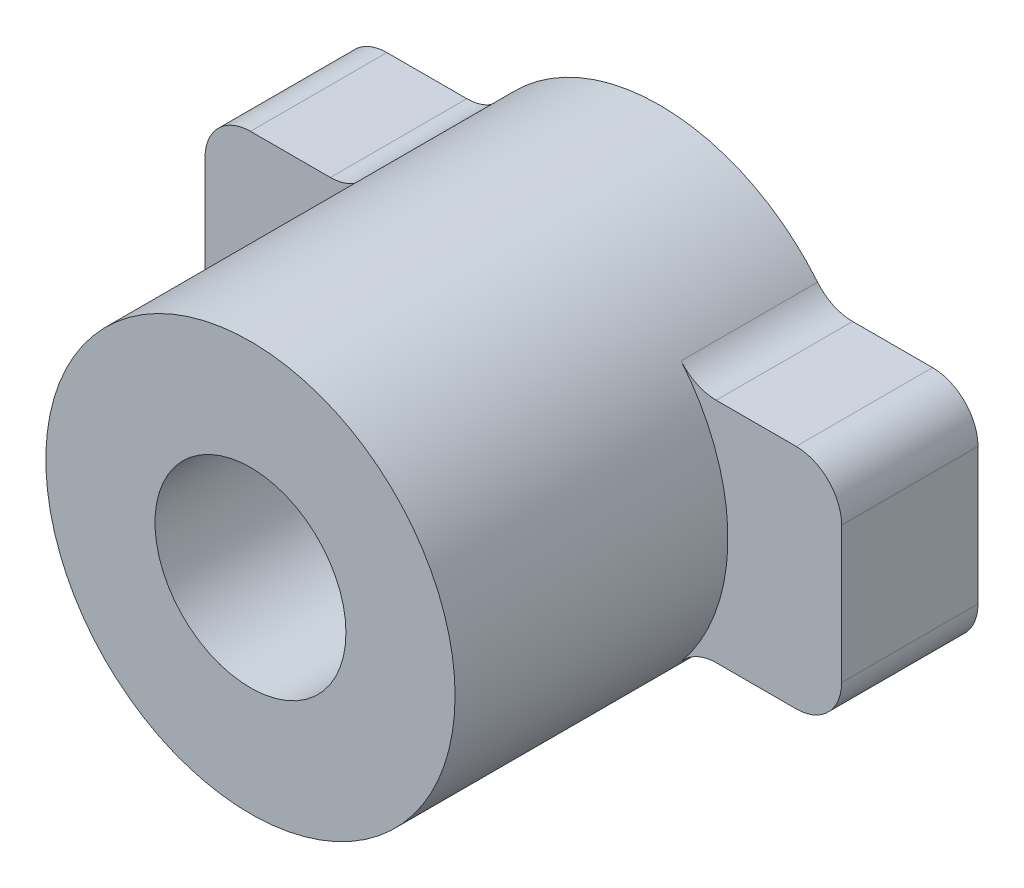
ISO-10303-21;
HEADER;
FILE_DESCRIPTION(('STEP AP214'),'2;1');
FILE_NAME('part.step','',(''),(''),'','','');
FILE_SCHEMA(('AUTOMOTIVE_DESIGN { 1 0 10303 214 1 1 1 1 }'));
ENDSEC;
DATA;
#1=APPLICATION_CONTEXT('core data for automotive mechanical design processes');
#2=APPLICATION_PROTOCOL_DEFINITION('international standard','automotive_design',2000,#1);
#3=PRODUCT_CONTEXT('',#1,'mechanical');
#4=PRODUCT('Part','Part','',(#3));
#5=PRODUCT_RELATED_PRODUCT_CATEGORY('part','',(#4));
#6=PRODUCT_DEFINITION_FORMATION('','',#4);
#7=PRODUCT_DEFINITION_CONTEXT('part definition',#1,'design');
#8=PRODUCT_DEFINITION('design','',#6,#7);
#9=PRODUCT_DEFINITION_SHAPE('','',#8);
#10=(LENGTH_UNIT() NAMED_UNIT(*) SI_UNIT(.MILLI.,.METRE.));
#11=(NAMED_UNIT(*) PLANE_ANGLE_UNIT() SI_UNIT($,.RADIAN.));
#12=(NAMED_UNIT(*) SI_UNIT($,.STERADIAN.) SOLID_ANGLE_UNIT());
#13=UNCERTAINTY_MEASURE_WITH_UNIT(LENGTH_MEASURE(1.E-05),#10,'distance_accuracy_value','');
#14=(GEOMETRIC_REPRESENTATION_CONTEXT(3) GLOBAL_UNCERTAINTY_ASSIGNED_CONTEXT((#13)) GLOBAL_UNIT_ASSIGNED_CONTEXT((#10,
#11,#12)) REPRESENTATION_CONTEXT('',''));
#15=CARTESIAN_POINT('',(0.,0.,0.));
#16=DIRECTION('',(0.,0.,1.));
#17=DIRECTION('',(1.,0.,0.));
#18=AXIS2_PLACEMENT_3D('',#15,#16,#17);
#19=CARTESIAN_POINT('',(0.,0.,9.));
#20=DIRECTION('',(0.,0.,-1.));
#21=DIRECTION('',(-1.,0.,0.));
#22=AXIS2_PLACEMENT_3D('',#19,#20,#21);
#23=CYLINDRICAL_SURFACE('',#22,4.5);
#24=CARTESIAN_POINT('',(0.,0.,0.));
#25=DIRECTION('',(0.,0.,1.));
#26=DIRECTION('',(1.,0.,0.));
#27=AXIS2_PLACEMENT_3D('',#24,#25,#26);
#28=CIRCLE('',#27,4.5);
#29=CARTESIAN_POINT('',(3.47125147127942,2.86363636363636,0.));
#30=VERTEX_POINT('',#29);
#31=CARTESIAN_POINT('',(-3.47125147127941,2.86363636363636,0.));
#32=VERTEX_POINT('',#31);
#33=EDGE_CURVE('E182',#30,#32,#28,.T.);
#34=ORIENTED_EDGE('',*,*,#33,.T.);
#35=DIRECTION('',(0.,0.,-1.));
#36=VECTOR('',#35,1.);
#37=CARTESIAN_POINT('',(-3.47125147127942,2.86363636363636,9.));
#38=LINE('',#37,#36);
#39=CARTESIAN_POINT('',(-3.47125147127941,2.86363636363636,3.));
#40=VERTEX_POINT('',#39);
#41=EDGE_CURVE('E175',#32,#40,#38,.F.);
#42=ORIENTED_EDGE('',*,*,#41,.T.);
#43=CARTESIAN_POINT('',(0.,0.,3.));
#44=DIRECTION('',(0.,0.,1.));
#45=DIRECTION('',(1.,0.,0.));
#46=AXIS2_PLACEMENT_3D('',#43,#44,#45);
#47=CIRCLE('',#46,4.5);
#48=CARTESIAN_POINT('',(-3.47125147127941,-2.86363636363636,3.));
#49=VERTEX_POINT('',#48);
#50=EDGE_CURVE('E173',#40,#49,#47,.T.);
#51=ORIENTED_EDGE('',*,*,#50,.T.);
#52=DIRECTION('',(0.,0.,-1.));
#53=VECTOR('',#52,1.);
#54=CARTESIAN_POINT('',(-3.47125147127942,-2.86363636363636,9.));
#55=LINE('',#54,#53);
#56=CARTESIAN_POINT('',(-3.47125147127941,-2.86363636363636,0.));
#57=VERTEX_POINT('',#56);
#58=EDGE_CURVE('E156',#49,#57,#55,.T.);
#59=ORIENTED_EDGE('',*,*,#58,.T.);
#60=CARTESIAN_POINT('',(3.47125147127942,-2.86363636363636,0.));
#61=VERTEX_POINT('',#60);
#62=EDGE_CURVE('E170',#57,#61,#28,.T.);
#63=ORIENTED_EDGE('',*,*,#62,.T.);
#64=DIRECTION('',(0.,0.,-1.));
#65=VECTOR('',#64,1.);
#66=CARTESIAN_POINT('',(3.47125147127942,-2.86363636363636,9.));
#67=LINE('',#66,#65);
#68=CARTESIAN_POINT('',(3.47125147127942,-2.86363636363636,3.));
#69=VERTEX_POINT('',#68);
#70=EDGE_CURVE('E193',#61,#69,#67,.F.);
#71=ORIENTED_EDGE('',*,*,#70,.T.);
#72=CARTESIAN_POINT('',(3.47125147127942,2.86363636363636,3.));
#73=VERTEX_POINT('',#72);
#74=EDGE_CURVE('E191',#69,#73,#47,.T.);
#75=ORIENTED_EDGE('',*,*,#74,.T.);
#76=DIRECTION('',(0.,0.,-1.));
#77=VECTOR('',#76,1.);
#78=CARTESIAN_POINT('',(3.47125147127942,2.86363636363636,9.));
#79=LINE('',#78,#77);
#80=EDGE_CURVE('E176',#73,#30,#79,.T.);
#81=ORIENTED_EDGE('',*,*,#80,.T.);
#82=EDGE_LOOP('',(#34,#42,#51,#59,#63,#71,#75,#81));
#83=FACE_BOUND('',#82,.T.);
#84=CARTESIAN_POINT('',(0.,0.,9.));
#85=DIRECTION('',(0.,0.,1.));
#86=DIRECTION('',(1.,0.,0.));
#87=AXIS2_PLACEMENT_3D('',#84,#85,#86);
#88=CIRCLE('',#87,4.5);
#89=CARTESIAN_POINT('',(4.5,0.,9.));
#90=VERTEX_POINT('',#89);
#91=EDGE_CURVE('E185',#90,#90,#88,.T.);
#92=ORIENTED_EDGE('',*,*,#91,.F.);
#93=EDGE_LOOP('',(#92));
#94=FACE_BOUND('',#93,.T.);
#95=ADVANCED_FACE('F40',(#83,#94),#23,.T.);
#96=CARTESIAN_POINT('',(0.,0.,9.));
#97=DIRECTION('',(0.,0.,1.));
#98=DIRECTION('',(1.,0.,0.));
#99=AXIS2_PLACEMENT_3D('',#96,#97,#98);
#100=PLANE('',#99);
#101=CARTESIAN_POINT('',(0.,0.,9.));
#102=DIRECTION('',(0.,0.,1.));
#103=DIRECTION('',(1.,0.,0.));
#104=AXIS2_PLACEMENT_3D('',#101,#102,#103);
#105=CIRCLE('',#104,2.1);
#106=CARTESIAN_POINT('',(2.1,0.,9.));
#107=VERTEX_POINT('',#106);
#108=EDGE_CURVE('E384',#107,#107,#105,.T.);
#109=ORIENTED_EDGE('',*,*,#108,.F.);
#110=EDGE_LOOP('',(#109));
#111=FACE_BOUND('',#110,.T.);
#112=ORIENTED_EDGE('',*,*,#91,.T.);
#113=EDGE_LOOP('',(#112));
#114=FACE_BOUND('',#113,.T.);
#115=ADVANCED_FACE('F326',(#111,#114),#100,.T.);
#116=CARTESIAN_POINT('',(0.,0.,0.));
#117=DIRECTION('',(0.,0.,1.));
#118=DIRECTION('',(1.,0.,0.));
#119=AXIS2_PLACEMENT_3D('',#116,#117,#118);
#120=PLANE('',#119);
#121=CARTESIAN_POINT('',(0.,0.,0.));
#122=DIRECTION('',(0.,0.,1.));
#123=DIRECTION('',(1.,0.,0.));
#124=AXIS2_PLACEMENT_3D('',#121,#122,#123);
#125=CIRCLE('',#124,2.1);
#126=CARTESIAN_POINT('',(2.1,0.,0.));
#127=VERTEX_POINT('',#126);
#128=EDGE_CURVE('E290',#127,#127,#125,.T.);
#129=ORIENTED_EDGE('',*,*,#128,.T.);
#130=EDGE_LOOP('',(#129));
#131=FACE_BOUND('',#130,.T.);
#132=DIRECTION('',(0.,1.,0.));
#133=VECTOR('',#132,1.);
#134=CARTESIAN_POINT('',(-7.,-2.5,0.));
#135=LINE('',#134,#133);
#136=CARTESIAN_POINT('',(-7.,-1.5,0.));
#137=VERTEX_POINT('',#136);
#138=CARTESIAN_POINT('',(-7.,1.5,0.));
#139=VERTEX_POINT('',#138);
#140=EDGE_CURVE('E287',#137,#139,#135,.T.);
#141=ORIENTED_EDGE('',*,*,#140,.T.);
#142=CARTESIAN_POINT('',(-6.,1.5,0.));
#143=DIRECTION('',(0.,0.,1.));
#144=DIRECTION('',(1.,0.,0.));
#145=AXIS2_PLACEMENT_3D('',#142,#143,#144);
#146=CIRCLE('',#145,1.);
#147=CARTESIAN_POINT('',(-6.,2.5,0.));
#148=VERTEX_POINT('',#147);
#149=EDGE_CURVE('E213',#139,#148,#146,.F.);
#150=ORIENTED_EDGE('',*,*,#149,.T.);
#151=DIRECTION('',(1.,0.,0.));
#152=VECTOR('',#151,1.);
#153=CARTESIAN_POINT('',(7.,2.5,0.));
#154=LINE('',#153,#152);
#155=CARTESIAN_POINT('',(-4.24264068711929,2.5,0.));
#156=VERTEX_POINT('',#155);
#157=EDGE_CURVE('E265',#148,#156,#154,.T.);
#158=ORIENTED_EDGE('',*,*,#157,.T.);
#159=CARTESIAN_POINT('',(-4.24264068711928,3.5,0.));
#160=DIRECTION('',(0.,0.,1.));
#161=DIRECTION('',(1.,0.,0.));
#162=AXIS2_PLACEMENT_3D('',#159,#160,#161);
#163=CIRCLE('',#162,1.);
#164=EDGE_CURVE('E163',#156,#32,#163,.T.);
#165=ORIENTED_EDGE('',*,*,#164,.T.);
#166=ORIENTED_EDGE('',*,*,#33,.F.);
#167=CARTESIAN_POINT('',(4.24264068711928,3.5,0.));
#168=DIRECTION('',(0.,0.,1.));
#169=DIRECTION('',(1.,0.,0.));
#170=AXIS2_PLACEMENT_3D('',#167,#168,#169);
#171=CIRCLE('',#170,1.);
#172=CARTESIAN_POINT('',(4.24264068711928,2.5,0.));
#173=VERTEX_POINT('',#172);
#174=EDGE_CURVE('E244',#30,#173,#171,.T.);
#175=ORIENTED_EDGE('',*,*,#174,.T.);
#176=CARTESIAN_POINT('',(6.,2.5,0.));
#177=VERTEX_POINT('',#176);
#178=EDGE_CURVE('E289',#173,#177,#154,.T.);
#179=ORIENTED_EDGE('',*,*,#178,.T.);
#180=CARTESIAN_POINT('',(6.,1.5,0.));
#181=DIRECTION('',(0.,0.,1.));
#182=DIRECTION('',(1.,0.,0.));
#183=AXIS2_PLACEMENT_3D('',#180,#181,#182);
#184=CIRCLE('',#183,1.);
#185=CARTESIAN_POINT('',(7.,1.5,0.));
#186=VERTEX_POINT('',#185);
#187=EDGE_CURVE('E209',#177,#186,#184,.F.);
#188=ORIENTED_EDGE('',*,*,#187,.T.);
#189=DIRECTION('',(0.,-1.,0.));
#190=VECTOR('',#189,1.);
#191=CARTESIAN_POINT('',(7.,-2.5,0.));
#192=LINE('',#191,#190);
#193=CARTESIAN_POINT('',(7.,-1.5,0.));
#194=VERTEX_POINT('',#193);
#195=EDGE_CURVE('E292',#186,#194,#192,.T.);
#196=ORIENTED_EDGE('',*,*,#195,.T.);
#197=CARTESIAN_POINT('',(6.,-1.5,0.));
#198=DIRECTION('',(0.,0.,1.));
#199=DIRECTION('',(1.,0.,0.));
#200=AXIS2_PLACEMENT_3D('',#197,#198,#199);
#201=CIRCLE('',#200,1.);
#202=CARTESIAN_POINT('',(6.,-2.5,0.));
#203=VERTEX_POINT('',#202);
#204=EDGE_CURVE('E207',#194,#203,#201,.F.);
#205=ORIENTED_EDGE('',*,*,#204,.T.);
#206=DIRECTION('',(-1.,0.,0.));
#207=VECTOR('',#206,1.);
#208=CARTESIAN_POINT('',(7.,-2.5,0.));
#209=LINE('',#208,#207);
#210=CARTESIAN_POINT('',(4.24264068711928,-2.5,0.));
#211=VERTEX_POINT('',#210);
#212=EDGE_CURVE('E295',#203,#211,#209,.T.);
#213=ORIENTED_EDGE('',*,*,#212,.T.);
#214=CARTESIAN_POINT('',(4.24264068711928,-3.5,0.));
#215=DIRECTION('',(0.,0.,1.));
#216=DIRECTION('',(1.,0.,0.));
#217=AXIS2_PLACEMENT_3D('',#214,#215,#216);
#218=CIRCLE('',#217,1.);
#219=EDGE_CURVE('E11',#211,#61,#218,.T.);
#220=ORIENTED_EDGE('',*,*,#219,.T.);
#221=ORIENTED_EDGE('',*,*,#62,.F.);
#222=CARTESIAN_POINT('',(-4.24264068711928,-3.5,0.));
#223=DIRECTION('',(0.,0.,1.));
#224=DIRECTION('',(1.,0.,0.));
#225=AXIS2_PLACEMENT_3D('',#222,#223,#224);
#226=CIRCLE('',#225,1.);
#227=CARTESIAN_POINT('',(-4.24264068711929,-2.5,0.));
#228=VERTEX_POINT('',#227);
#229=EDGE_CURVE('E152',#57,#228,#226,.T.);
#230=ORIENTED_EDGE('',*,*,#229,.T.);
#231=CARTESIAN_POINT('',(-6.,-2.5,0.));
#232=VERTEX_POINT('',#231);
#233=EDGE_CURVE('E294',#228,#232,#209,.T.);
#234=ORIENTED_EDGE('',*,*,#233,.T.);
#235=CARTESIAN_POINT('',(-6.,-1.5,0.));
#236=DIRECTION('',(0.,0.,1.));
#237=DIRECTION('',(1.,0.,0.));
#238=AXIS2_PLACEMENT_3D('',#235,#236,#237);
#239=CIRCLE('',#238,1.);
#240=EDGE_CURVE('E211',#232,#137,#239,.F.);
#241=ORIENTED_EDGE('',*,*,#240,.T.);
#242=EDGE_LOOP('',(#141,#150,#158,#165,#166,#175,#179,#188,#196,#205,#213,#220,#221,#230,#234,#241));
#243=FACE_BOUND('',#242,.T.);
#244=ADVANCED_FACE('F179',(#131,#243),#120,.F.);
#245=CARTESIAN_POINT('',(7.,-2.5,3.));
#246=DIRECTION('',(1.,0.,0.));
#247=DIRECTION('',(0.,0.,-1.));
#248=AXIS2_PLACEMENT_3D('',#245,#246,#247);
#249=PLANE('',#248);
#250=ORIENTED_EDGE('',*,*,#195,.F.);
#251=DIRECTION('',(0.,0.,-1.));
#252=VECTOR('',#251,1.);
#253=CARTESIAN_POINT('',(7.,1.5,3.));
#254=LINE('',#253,#252);
#255=CARTESIAN_POINT('',(7.,1.5,3.));
#256=VERTEX_POINT('',#255);
#257=EDGE_CURVE('E231',#186,#256,#254,.F.);
#258=ORIENTED_EDGE('',*,*,#257,.T.);
#259=DIRECTION('',(0.,-1.,0.));
#260=VECTOR('',#259,1.);
#261=CARTESIAN_POINT('',(7.,-2.5,3.));
#262=LINE('',#261,#260);
#263=CARTESIAN_POINT('',(7.,-1.5,3.));
#264=VERTEX_POINT('',#263);
#265=EDGE_CURVE('E279',#256,#264,#262,.T.);
#266=ORIENTED_EDGE('',*,*,#265,.T.);
#267=DIRECTION('',(0.,0.,-1.));
#268=VECTOR('',#267,1.);
#269=CARTESIAN_POINT('',(7.,-1.5,3.));
#270=LINE('',#269,#268);
#271=EDGE_CURVE('E228',#264,#194,#270,.T.);
#272=ORIENTED_EDGE('',*,*,#271,.T.);
#273=EDGE_LOOP('',(#250,#258,#266,#272));
#274=FACE_BOUND('',#273,.T.);
#275=ADVANCED_FACE('F361',(#274),#249,.T.);
#276=CARTESIAN_POINT('',(0.,0.,3.));
#277=DIRECTION('',(0.,0.,1.));
#278=DIRECTION('',(1.,0.,0.));
#279=AXIS2_PLACEMENT_3D('',#276,#277,#278);
#280=PLANE('',#279);
#281=ORIENTED_EDGE('',*,*,#265,.F.);
#282=CARTESIAN_POINT('',(6.,1.5,3.));
#283=DIRECTION('',(0.,0.,1.));
#284=DIRECTION('',(1.,0.,0.));
#285=AXIS2_PLACEMENT_3D('',#282,#283,#284);
#286=CIRCLE('',#285,1.);
#287=CARTESIAN_POINT('',(6.,2.5,3.));
#288=VERTEX_POINT('',#287);
#289=EDGE_CURVE('E235',#256,#288,#286,.T.);
#290=ORIENTED_EDGE('',*,*,#289,.T.);
#291=DIRECTION('',(1.,0.,0.));
#292=VECTOR('',#291,1.);
#293=CARTESIAN_POINT('',(7.,2.5,3.));
#294=LINE('',#293,#292);
#295=CARTESIAN_POINT('',(4.24264068711928,2.5,3.));
#296=VERTEX_POINT('',#295);
#297=EDGE_CURVE('E254',#296,#288,#294,.T.);
#298=ORIENTED_EDGE('',*,*,#297,.F.);
#299=CARTESIAN_POINT('',(4.24264068711928,3.5,3.));
#300=DIRECTION('',(0.,0.,1.));
#301=DIRECTION('',(1.,0.,0.));
#302=AXIS2_PLACEMENT_3D('',#299,#300,#301);
#303=CIRCLE('',#302,1.);
#304=EDGE_CURVE('E246',#296,#73,#303,.F.);
#305=ORIENTED_EDGE('',*,*,#304,.T.);
#306=ORIENTED_EDGE('',*,*,#74,.F.);
#307=CARTESIAN_POINT('',(4.24264068711928,-3.5,3.));
#308=DIRECTION('',(0.,0.,1.));
#309=DIRECTION('',(1.,0.,0.));
#310=AXIS2_PLACEMENT_3D('',#307,#308,#309);
#311=CIRCLE('',#310,1.);
#312=CARTESIAN_POINT('',(4.24264068711928,-2.5,3.));
#313=VERTEX_POINT('',#312);
#314=EDGE_CURVE('E48',#69,#313,#311,.F.);
#315=ORIENTED_EDGE('',*,*,#314,.T.);
#316=DIRECTION('',(-1.,0.,0.));
#317=VECTOR('',#316,1.);
#318=CARTESIAN_POINT('',(7.,-2.5,3.));
#319=LINE('',#318,#317);
#320=CARTESIAN_POINT('',(6.,-2.5,3.));
#321=VERTEX_POINT('',#320);
#322=EDGE_CURVE('E183',#321,#313,#319,.T.);
#323=ORIENTED_EDGE('',*,*,#322,.F.);
#324=CARTESIAN_POINT('',(6.,-1.5,3.));
#325=DIRECTION('',(0.,0.,1.));
#326=DIRECTION('',(1.,0.,0.));
#327=AXIS2_PLACEMENT_3D('',#324,#325,#326);
#328=CIRCLE('',#327,1.);
#329=EDGE_CURVE('E233',#321,#264,#328,.T.);
#330=ORIENTED_EDGE('',*,*,#329,.T.);
#331=EDGE_LOOP('',(#281,#290,#298,#305,#306,#315,#323,#330));
#332=FACE_BOUND('',#331,.T.);
#333=ADVANCED_FACE('F252',(#332),#280,.T.);
#334=CARTESIAN_POINT('',(7.,2.5,3.));
#335=DIRECTION('',(0.,1.,0.));
#336=DIRECTION('',(-1.,0.,0.));
#337=AXIS2_PLACEMENT_3D('',#334,#335,#336);
#338=PLANE('',#337);
#339=ORIENTED_EDGE('',*,*,#297,.T.);
#340=DIRECTION('',(0.,0.,-1.));
#341=VECTOR('',#340,1.);
#342=CARTESIAN_POINT('',(6.,2.5,3.));
#343=LINE('',#342,#341);
#344=EDGE_CURVE('E225',#288,#177,#343,.T.);
#345=ORIENTED_EDGE('',*,*,#344,.T.);
#346=ORIENTED_EDGE('',*,*,#178,.F.);
#347=DIRECTION('',(0.,0.,-1.));
#348=VECTOR('',#347,1.);
#349=CARTESIAN_POINT('',(4.24264068711928,2.5,3.));
#350=LINE('',#349,#348);
#351=EDGE_CURVE('E223',#173,#296,#350,.F.);
#352=ORIENTED_EDGE('',*,*,#351,.T.);
#353=EDGE_LOOP('',(#339,#345,#346,#352));
#354=FACE_BOUND('',#353,.T.);
#355=ADVANCED_FACE('F321',(#354),#338,.T.);
#356=CARTESIAN_POINT('',(7.,-2.5,3.));
#357=DIRECTION('',(0.,-1.,0.));
#358=DIRECTION('',(1.,0.,0.));
#359=AXIS2_PLACEMENT_3D('',#356,#357,#358);
#360=PLANE('',#359);
#361=ORIENTED_EDGE('',*,*,#322,.T.);
#362=DIRECTION('',(0.,0.,-1.));
#363=VECTOR('',#362,1.);
#364=CARTESIAN_POINT('',(4.24264068711928,-2.5,3.));
#365=LINE('',#364,#363);
#366=EDGE_CURVE('E238',#313,#211,#365,.T.);
#367=ORIENTED_EDGE('',*,*,#366,.T.);
#368=ORIENTED_EDGE('',*,*,#212,.F.);
#369=DIRECTION('',(0.,0.,-1.));
#370=VECTOR('',#369,1.);
#371=CARTESIAN_POINT('',(6.,-2.5,3.));
#372=LINE('',#371,#370);
#373=EDGE_CURVE('E61',#203,#321,#372,.F.);
#374=ORIENTED_EDGE('',*,*,#373,.T.);
#375=EDGE_LOOP('',(#361,#367,#368,#374));
#376=FACE_BOUND('',#375,.T.);
#377=ADVANCED_FACE('F315',(#376),#360,.T.);
#378=CARTESIAN_POINT('',(-6.,2.5,3.));
#379=VERTEX_POINT('',#378);
#380=CARTESIAN_POINT('',(-4.24264068711929,2.5,3.));
#381=VERTEX_POINT('',#380);
#382=EDGE_CURVE('E274',#379,#381,#294,.T.);
#383=ORIENTED_EDGE('',*,*,#382,.F.);
#384=CARTESIAN_POINT('',(-6.,1.5,3.));
#385=DIRECTION('',(0.,0.,1.));
#386=DIRECTION('',(1.,0.,0.));
#387=AXIS2_PLACEMENT_3D('',#384,#385,#386);
#388=CIRCLE('',#387,1.);
#389=CARTESIAN_POINT('',(-7.,1.5,3.));
#390=VERTEX_POINT('',#389);
#391=EDGE_CURVE('E217',#379,#390,#388,.T.);
#392=ORIENTED_EDGE('',*,*,#391,.T.);
#393=DIRECTION('',(0.,1.,0.));
#394=VECTOR('',#393,1.);
#395=CARTESIAN_POINT('',(-7.,-2.5,3.));
#396=LINE('',#395,#394);
#397=CARTESIAN_POINT('',(-7.,-1.5,3.));
#398=VERTEX_POINT('',#397);
#399=EDGE_CURVE('E283',#398,#390,#396,.T.);
#400=ORIENTED_EDGE('',*,*,#399,.F.);
#401=CARTESIAN_POINT('',(-6.,-1.5,3.));
#402=DIRECTION('',(0.,0.,1.));
#403=DIRECTION('',(1.,0.,0.));
#404=AXIS2_PLACEMENT_3D('',#401,#402,#403);
#405=CIRCLE('',#404,1.);
#406=CARTESIAN_POINT('',(-6.,-2.5,3.));
#407=VERTEX_POINT('',#406);
#408=EDGE_CURVE('E215',#398,#407,#405,.T.);
#409=ORIENTED_EDGE('',*,*,#408,.T.);
#410=CARTESIAN_POINT('',(-4.24264068711929,-2.5,3.));
#411=VERTEX_POINT('',#410);
#412=EDGE_CURVE('E186',#411,#407,#319,.T.);
#413=ORIENTED_EDGE('',*,*,#412,.F.);
#414=CARTESIAN_POINT('',(-4.24264068711928,-3.5,3.));
#415=DIRECTION('',(0.,0.,1.));
#416=DIRECTION('',(1.,0.,0.));
#417=AXIS2_PLACEMENT_3D('',#414,#415,#416);
#418=CIRCLE('',#417,1.);
#419=EDGE_CURVE('E162',#411,#49,#418,.F.);
#420=ORIENTED_EDGE('',*,*,#419,.T.);
#421=ORIENTED_EDGE('',*,*,#50,.F.);
#422=CARTESIAN_POINT('',(-4.24264068711928,3.5,3.));
#423=DIRECTION('',(0.,0.,1.));
#424=DIRECTION('',(1.,0.,0.));
#425=AXIS2_PLACEMENT_3D('',#422,#423,#424);
#426=CIRCLE('',#425,1.);
#427=EDGE_CURVE('E240',#40,#381,#426,.F.);
#428=ORIENTED_EDGE('',*,*,#427,.T.);
#429=EDGE_LOOP('',(#383,#392,#400,#409,#413,#420,#421,#428));
#430=FACE_BOUND('',#429,.T.);
#431=ADVANCED_FACE('F273',(#430),#280,.T.);
#432=ORIENTED_EDGE('',*,*,#412,.T.);
#433=DIRECTION('',(0.,0.,-1.));
#434=VECTOR('',#433,1.);
#435=CARTESIAN_POINT('',(-6.,-2.5,3.));
#436=LINE('',#435,#434);
#437=EDGE_CURVE('E220',#407,#232,#436,.T.);
#438=ORIENTED_EDGE('',*,*,#437,.T.);
#439=ORIENTED_EDGE('',*,*,#233,.F.);
#440=DIRECTION('',(0.,0.,-1.));
#441=VECTOR('',#440,1.);
#442=CARTESIAN_POINT('',(-4.24264068711929,-2.5,3.));
#443=LINE('',#442,#441);
#444=EDGE_CURVE('E157',#228,#411,#443,.F.);
#445=ORIENTED_EDGE('',*,*,#444,.T.);
#446=EDGE_LOOP('',(#432,#438,#439,#445));
#447=FACE_BOUND('',#446,.T.);
#448=ADVANCED_FACE('F312',(#447),#360,.T.);
#449=ORIENTED_EDGE('',*,*,#382,.T.);
#450=DIRECTION('',(0.,0.,-1.));
#451=VECTOR('',#450,1.);
#452=CARTESIAN_POINT('',(-4.24264068711929,2.5,3.));
#453=LINE('',#452,#451);
#454=EDGE_CURVE('E200',#381,#156,#453,.T.);
#455=ORIENTED_EDGE('',*,*,#454,.T.);
#456=ORIENTED_EDGE('',*,*,#157,.F.);
#457=DIRECTION('',(0.,0.,-1.));
#458=VECTOR('',#457,1.);
#459=CARTESIAN_POINT('',(-6.,2.5,3.));
#460=LINE('',#459,#458);
#461=EDGE_CURVE('E198',#148,#379,#460,.F.);
#462=ORIENTED_EDGE('',*,*,#461,.T.);
#463=EDGE_LOOP('',(#449,#455,#456,#462));
#464=FACE_BOUND('',#463,.T.);
#465=ADVANCED_FACE('F277',(#464),#338,.T.);
#466=CARTESIAN_POINT('',(-7.,-2.5,3.));
#467=DIRECTION('',(-1.,0.,0.));
#468=DIRECTION('',(0.,0.,1.));
#469=AXIS2_PLACEMENT_3D('',#466,#467,#468);
#470=PLANE('',#469);
#471=ORIENTED_EDGE('',*,*,#399,.T.);
#472=DIRECTION('',(0.,0.,-1.));
#473=VECTOR('',#472,1.);
#474=CARTESIAN_POINT('',(-7.,1.5,3.));
#475=LINE('',#474,#473);
#476=EDGE_CURVE('E204',#390,#139,#475,.T.);
#477=ORIENTED_EDGE('',*,*,#476,.T.);
#478=ORIENTED_EDGE('',*,*,#140,.F.);
#479=DIRECTION('',(0.,0.,-1.));
#480=VECTOR('',#479,1.);
#481=CARTESIAN_POINT('',(-7.,-1.5,3.));
#482=LINE('',#481,#480);
#483=EDGE_CURVE('E202',#137,#398,#482,.F.);
#484=ORIENTED_EDGE('',*,*,#483,.T.);
#485=EDGE_LOOP('',(#471,#477,#478,#484));
#486=FACE_BOUND('',#485,.T.);
#487=ADVANCED_FACE('F300',(#486),#470,.T.);
#488=CARTESIAN_POINT('',(0.,0.,9.));
#489=DIRECTION('',(0.,0.,1.));
#490=DIRECTION('',(1.,0.,0.));
#491=AXIS2_PLACEMENT_3D('',#488,#489,#490);
#492=CYLINDRICAL_SURFACE('',#491,2.1);
#493=ORIENTED_EDGE('',*,*,#128,.F.);
#494=EDGE_LOOP('',(#493));
#495=FACE_BOUND('',#494,.T.);
#496=ORIENTED_EDGE('',*,*,#108,.T.);
#497=EDGE_LOOP('',(#496));
#498=FACE_BOUND('',#497,.T.);
#499=ADVANCED_FACE('F337',(#495,#498),#492,.F.);
#500=CARTESIAN_POINT('',(-4.24264068711928,3.5,9.));
#501=DIRECTION('',(0.,0.,-1.));
#502=DIRECTION('',(-1.,0.,0.));
#503=AXIS2_PLACEMENT_3D('',#500,#501,#502);
#504=CYLINDRICAL_SURFACE('',#503,1.);
#505=ORIENTED_EDGE('',*,*,#164,.F.);
#506=ORIENTED_EDGE('',*,*,#454,.F.);
#507=ORIENTED_EDGE('',*,*,#427,.F.);
#508=ORIENTED_EDGE('',*,*,#41,.F.);
#509=EDGE_LOOP('',(#505,#506,#507,#508));
#510=FACE_BOUND('',#509,.T.);
#511=ADVANCED_FACE('F268',(#510),#504,.F.);
#512=CARTESIAN_POINT('',(-6.,1.5,3.));
#513=DIRECTION('',(0.,0.,-1.));
#514=DIRECTION('',(-1.,0.,0.));
#515=AXIS2_PLACEMENT_3D('',#512,#513,#514);
#516=CYLINDRICAL_SURFACE('',#515,1.);
#517=ORIENTED_EDGE('',*,*,#391,.F.);
#518=ORIENTED_EDGE('',*,*,#461,.F.);
#519=ORIENTED_EDGE('',*,*,#149,.F.);
#520=ORIENTED_EDGE('',*,*,#476,.F.);
#521=EDGE_LOOP('',(#517,#518,#519,#520));
#522=FACE_BOUND('',#521,.T.);
#523=ADVANCED_FACE('F305',(#522),#516,.T.);
#524=CARTESIAN_POINT('',(-6.,-1.5,3.));
#525=DIRECTION('',(0.,0.,-1.));
#526=DIRECTION('',(-1.,0.,0.));
#527=AXIS2_PLACEMENT_3D('',#524,#525,#526);
#528=CYLINDRICAL_SURFACE('',#527,1.);
#529=ORIENTED_EDGE('',*,*,#408,.F.);
#530=ORIENTED_EDGE('',*,*,#483,.F.);
#531=ORIENTED_EDGE('',*,*,#240,.F.);
#532=ORIENTED_EDGE('',*,*,#437,.F.);
#533=EDGE_LOOP('',(#529,#530,#531,#532));
#534=FACE_BOUND('',#533,.T.);
#535=ADVANCED_FACE('F307',(#534),#528,.T.);
#536=CARTESIAN_POINT('',(-4.24264068711928,-3.5,9.));
#537=DIRECTION('',(0.,0.,-1.));
#538=DIRECTION('',(-1.,0.,0.));
#539=AXIS2_PLACEMENT_3D('',#536,#537,#538);
#540=CYLINDRICAL_SURFACE('',#539,1.);
#541=ORIENTED_EDGE('',*,*,#419,.F.);
#542=ORIENTED_EDGE('',*,*,#444,.F.);
#543=ORIENTED_EDGE('',*,*,#229,.F.);
#544=ORIENTED_EDGE('',*,*,#58,.F.);
#545=EDGE_LOOP('',(#541,#542,#543,#544));
#546=FACE_BOUND('',#545,.T.);
#547=ADVANCED_FACE('F155',(#546),#540,.F.);
#548=CARTESIAN_POINT('',(6.,1.5,3.));
#549=DIRECTION('',(0.,0.,-1.));
#550=DIRECTION('',(-1.,0.,0.));
#551=AXIS2_PLACEMENT_3D('',#548,#549,#550);
#552=CYLINDRICAL_SURFACE('',#551,1.);
#553=ORIENTED_EDGE('',*,*,#289,.F.);
#554=ORIENTED_EDGE('',*,*,#257,.F.);
#555=ORIENTED_EDGE('',*,*,#187,.F.);
#556=ORIENTED_EDGE('',*,*,#344,.F.);
#557=EDGE_LOOP('',(#553,#554,#555,#556));
#558=FACE_BOUND('',#557,.T.);
#559=ADVANCED_FACE('F344',(#558),#552,.T.);
#560=CARTESIAN_POINT('',(4.24264068711928,3.5,9.));
#561=DIRECTION('',(0.,0.,-1.));
#562=DIRECTION('',(-1.,0.,0.));
#563=AXIS2_PLACEMENT_3D('',#560,#561,#562);
#564=CYLINDRICAL_SURFACE('',#563,1.);
#565=ORIENTED_EDGE('',*,*,#304,.F.);
#566=ORIENTED_EDGE('',*,*,#351,.F.);
#567=ORIENTED_EDGE('',*,*,#174,.F.);
#568=ORIENTED_EDGE('',*,*,#80,.F.);
#569=EDGE_LOOP('',(#565,#566,#567,#568));
#570=FACE_BOUND('',#569,.T.);
#571=ADVANCED_FACE('F257',(#570),#564,.F.);
#572=CARTESIAN_POINT('',(4.24264068711928,-3.5,9.));
#573=DIRECTION('',(0.,0.,-1.));
#574=DIRECTION('',(-1.,0.,0.));
#575=AXIS2_PLACEMENT_3D('',#572,#573,#574);
#576=CYLINDRICAL_SURFACE('',#575,1.);
#577=ORIENTED_EDGE('',*,*,#219,.F.);
#578=ORIENTED_EDGE('',*,*,#366,.F.);
#579=ORIENTED_EDGE('',*,*,#314,.F.);
#580=ORIENTED_EDGE('',*,*,#70,.F.);
#581=EDGE_LOOP('',(#577,#578,#579,#580));
#582=FACE_BOUND('',#581,.T.);
#583=ADVANCED_FACE('F349',(#582),#576,.F.);
#584=CARTESIAN_POINT('',(6.,-1.5,3.));
#585=DIRECTION('',(0.,0.,-1.));
#586=DIRECTION('',(-1.,0.,0.));
#587=AXIS2_PLACEMENT_3D('',#584,#585,#586);
#588=CYLINDRICAL_SURFACE('',#587,1.);
#589=ORIENTED_EDGE('',*,*,#329,.F.);
#590=ORIENTED_EDGE('',*,*,#373,.F.);
#591=ORIENTED_EDGE('',*,*,#204,.F.);
#592=ORIENTED_EDGE('',*,*,#271,.F.);
#593=EDGE_LOOP('',(#589,#590,#591,#592));
#594=FACE_BOUND('',#593,.T.);
#595=ADVANCED_FACE('F42',(#594),#588,.T.);
#596=CLOSED_SHELL('',(#95,#115,#244,#275,#333,#355,#377,#431,#448,#465,#487,#499,#511,#523,#535,
#547,#559,#571,#583,#595));
#597=MANIFOLD_SOLID_BREP('B2',#596);
#598=ADVANCED_BREP_SHAPE_REPRESENTATION('',(#18,#597),#14);
#599=SHAPE_DEFINITION_REPRESENTATION(#9,#598);
ENDSEC;
END-ISO-10303-21;
